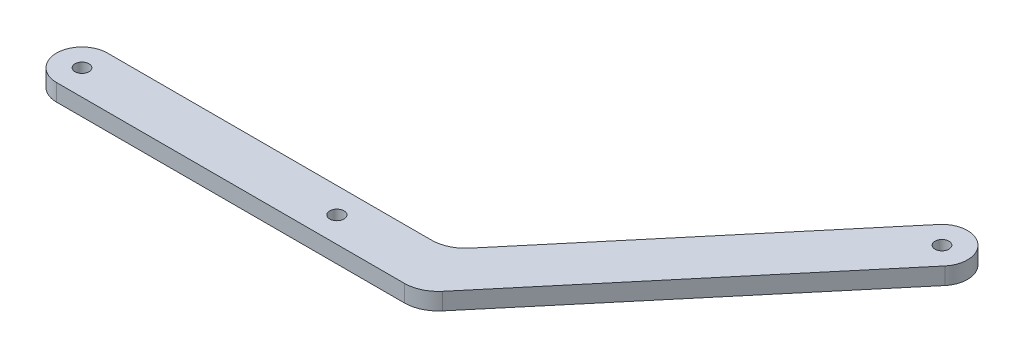
ISO-10303-21;
HEADER;
FILE_DESCRIPTION(('STEP AP214'),'2;1');
FILE_NAME('part.step','',(''),(''),'','','');
FILE_SCHEMA(('AUTOMOTIVE_DESIGN { 1 0 10303 214 1 1 1 1 }'));
ENDSEC;
DATA;
#1=APPLICATION_CONTEXT('core data for automotive mechanical design processes');
#2=APPLICATION_PROTOCOL_DEFINITION('international standard','automotive_design',2000,#1);
#3=PRODUCT_CONTEXT('',#1,'mechanical');
#4=PRODUCT('Part','Part','',(#3));
#5=PRODUCT_RELATED_PRODUCT_CATEGORY('part','',(#4));
#6=PRODUCT_DEFINITION_FORMATION('','',#4);
#7=PRODUCT_DEFINITION_CONTEXT('part definition',#1,'design');
#8=PRODUCT_DEFINITION('design','',#6,#7);
#9=PRODUCT_DEFINITION_SHAPE('','',#8);
#10=(LENGTH_UNIT() NAMED_UNIT(*) SI_UNIT(.MILLI.,.METRE.));
#11=(NAMED_UNIT(*) PLANE_ANGLE_UNIT() SI_UNIT($,.RADIAN.));
#12=(NAMED_UNIT(*) SI_UNIT($,.STERADIAN.) SOLID_ANGLE_UNIT());
#13=UNCERTAINTY_MEASURE_WITH_UNIT(LENGTH_MEASURE(1.E-05),#10,'distance_accuracy_value','');
#14=(GEOMETRIC_REPRESENTATION_CONTEXT(3) GLOBAL_UNCERTAINTY_ASSIGNED_CONTEXT((#13)) GLOBAL_UNIT_ASSIGNED_CONTEXT((#10,
#11,#12)) REPRESENTATION_CONTEXT('',''));
#15=CARTESIAN_POINT('',(0.,0.,0.));
#16=DIRECTION('',(0.,0.,1.));
#17=DIRECTION('',(1.,0.,0.));
#18=AXIS2_PLACEMENT_3D('',#15,#16,#17);
#19=CARTESIAN_POINT('',(-62.6973314606742,6.35,-0.214044943820216));
#20=DIRECTION('',(0.,1.,0.));
#21=DIRECTION('',(0.,0.,1.));
#22=AXIS2_PLACEMENT_3D('',#19,#20,#21);
#23=PLANE('',#22);
#24=CARTESIAN_POINT('',(155.391317213193,6.35,-103.475999794609));
#25=DIRECTION('',(0.,1.,0.));
#26=DIRECTION('',(0.,0.,1.));
#27=AXIS2_PLACEMENT_3D('',#24,#25,#26);
#28=CIRCLE('',#27,2.60349999999999);
#29=CARTESIAN_POINT('',(155.391317213193,6.35,-100.872499794609));
#30=VERTEX_POINT('',#29);
#31=EDGE_CURVE('E213',#30,#30,#28,.T.);
#32=ORIENTED_EDGE('',*,*,#31,.F.);
#33=EDGE_LOOP('',(#32));
#34=FACE_BOUND('',#33,.T.);
#35=CARTESIAN_POINT('',(-62.6973314606742,6.35,-0.214044943820216));
#36=DIRECTION('',(0.,1.,0.));
#37=DIRECTION('',(0.,0.,1.));
#38=AXIS2_PLACEMENT_3D('',#35,#36,#37);
#39=CIRCLE('',#38,9.525);
#40=CARTESIAN_POINT('',(-62.6973314606742,6.35,-9.73904494382022));
#41=VERTEX_POINT('',#40);
#42=CARTESIAN_POINT('',(-62.6973314606742,6.35,9.31095505617978));
#43=VERTEX_POINT('',#42);
#44=EDGE_CURVE('E164',#41,#43,#39,.T.);
#45=ORIENTED_EDGE('',*,*,#44,.T.);
#46=DIRECTION('',(1.,0.,0.));
#47=VECTOR('',#46,1.);
#48=CARTESIAN_POINT('',(-62.6973314606742,6.35,9.31095505617978));
#49=LINE('',#48,#47);
#50=CARTESIAN_POINT('',(67.2637221686101,6.35,9.31095505617978));
#51=VERTEX_POINT('',#50);
#52=EDGE_CURVE('E100',#43,#51,#49,.T.);
#53=ORIENTED_EDGE('',*,*,#52,.T.);
#54=CARTESIAN_POINT('',(67.2637221686101,6.35,-3.38904494382022));
#55=DIRECTION('',(0.,1.,0.));
#56=DIRECTION('',(0.,0.,1.));
#57=AXIS2_PLACEMENT_3D('',#54,#55,#56);
#58=CIRCLE('',#57,12.7);
#59=CARTESIAN_POINT('',(76.9924865962211,6.35,4.7743576991988));
#60=VERTEX_POINT('',#59);
#61=EDGE_CURVE('E185',#51,#60,#58,.T.);
#62=ORIENTED_EDGE('',*,*,#61,.T.);
#63=DIRECTION('',(0.642787609686537,0.,-0.76604444311898));
#64=VECTOR('',#63,1.);
#65=CARTESIAN_POINT('',(162.687890533902,6.35,-97.3534478123445));
#66=LINE('',#65,#64);
#67=CARTESIAN_POINT('',(162.687890533902,6.35,-97.3534478123445));
#68=VERTEX_POINT('',#67);
#69=EDGE_CURVE('E199',#60,#68,#66,.T.);
#70=ORIENTED_EDGE('',*,*,#69,.T.);
#71=CARTESIAN_POINT('',(155.391317213193,6.35,-103.475999794609));
#72=DIRECTION('',(0.,1.,0.));
#73=DIRECTION('',(0.,0.,-1.));
#74=AXIS2_PLACEMENT_3D('',#71,#72,#73);
#75=CIRCLE('',#74,9.525);
#76=CARTESIAN_POINT('',(148.094743892485,6.35,-109.598551776873));
#77=VERTEX_POINT('',#76);
#78=EDGE_CURVE('E119',#68,#77,#75,.T.);
#79=ORIENTED_EDGE('',*,*,#78,.T.);
#80=DIRECTION('',(-0.642787609686537,0.,0.76604444311898));
#81=VECTOR('',#80,1.);
#82=CARTESIAN_POINT('',(68.1093257083684,6.35,-14.2756423008012));
#83=LINE('',#82,#81);
#84=CARTESIAN_POINT('',(68.1093257083684,6.35,-14.2756423008012));
#85=VERTEX_POINT('',#84);
#86=EDGE_CURVE('E113',#77,#85,#83,.T.);
#87=ORIENTED_EDGE('',*,*,#86,.T.);
#88=CARTESIAN_POINT('',(58.3805612807573,6.35,-22.4390449438202));
#89=DIRECTION('',(0.,-1.,0.));
#90=DIRECTION('',(0.,0.,1.));
#91=AXIS2_PLACEMENT_3D('',#88,#89,#90);
#92=CIRCLE('',#91,12.7);
#93=CARTESIAN_POINT('',(58.3805612807573,6.35,-9.73904494382021));
#94=VERTEX_POINT('',#93);
#95=EDGE_CURVE('E117',#85,#94,#92,.T.);
#96=ORIENTED_EDGE('',*,*,#95,.T.);
#97=DIRECTION('',(-1.,0.,0.));
#98=VECTOR('',#97,1.);
#99=CARTESIAN_POINT('',(-62.6973314606742,6.35,-9.73904494382022));
#100=LINE('',#99,#98);
#101=EDGE_CURVE('E57',#94,#41,#100,.T.);
#102=ORIENTED_EDGE('',*,*,#101,.T.);
#103=EDGE_LOOP('',(#45,#53,#62,#70,#79,#87,#96,#102));
#104=FACE_BOUND('',#103,.T.);
#105=CARTESIAN_POINT('',(-62.6973314606742,6.35,-0.214044943820216));
#106=DIRECTION('',(0.,1.,0.));
#107=DIRECTION('',(0.,0.,1.));
#108=AXIS2_PLACEMENT_3D('',#105,#106,#107);
#109=CIRCLE('',#108,2.6035);
#110=CARTESIAN_POINT('',(-62.6973314606742,6.35,2.38945505617979));
#111=VERTEX_POINT('',#110);
#112=EDGE_CURVE('E146',#111,#111,#109,.T.);
#113=ORIENTED_EDGE('',*,*,#112,.F.);
#114=EDGE_LOOP('',(#113));
#115=FACE_BOUND('',#114,.T.);
#116=CARTESIAN_POINT('',(32.5526685393258,6.35,-0.214044943820216));
#117=DIRECTION('',(0.,1.,0.));
#118=DIRECTION('',(0.,0.,1.));
#119=AXIS2_PLACEMENT_3D('',#116,#117,#118);
#120=CIRCLE('',#119,2.667);
#121=CARTESIAN_POINT('',(32.5526685393258,6.35,2.45295505617979));
#122=VERTEX_POINT('',#121);
#123=EDGE_CURVE('E221',#122,#122,#120,.T.);
#124=ORIENTED_EDGE('',*,*,#123,.F.);
#125=EDGE_LOOP('',(#124));
#126=FACE_BOUND('',#125,.T.);
#127=ADVANCED_FACE('F39',(#34,#104,#115,#126),#23,.T.);
#128=CARTESIAN_POINT('',(-62.6973314606742,0.,-0.214044943820216));
#129=DIRECTION('',(0.,1.,0.));
#130=DIRECTION('',(0.,0.,1.));
#131=AXIS2_PLACEMENT_3D('',#128,#129,#130);
#132=PLANE('',#131);
#133=CARTESIAN_POINT('',(-62.6973314606742,0.,-0.214044943820216));
#134=DIRECTION('',(0.,1.,0.));
#135=DIRECTION('',(0.,0.,1.));
#136=AXIS2_PLACEMENT_3D('',#133,#134,#135);
#137=CIRCLE('',#136,9.525);
#138=CARTESIAN_POINT('',(-62.6973314606742,0.,-9.73904494382022));
#139=VERTEX_POINT('',#138);
#140=CARTESIAN_POINT('',(-62.6973314606742,0.,9.31095505617978));
#141=VERTEX_POINT('',#140);
#142=EDGE_CURVE('E141',#139,#141,#137,.T.);
#143=ORIENTED_EDGE('',*,*,#142,.F.);
#144=DIRECTION('',(-1.,0.,0.));
#145=VECTOR('',#144,1.);
#146=CARTESIAN_POINT('',(-62.6973314606742,0.,-9.73904494382022));
#147=LINE('',#146,#145);
#148=CARTESIAN_POINT('',(58.3805612807573,0.,-9.73904494382021));
#149=VERTEX_POINT('',#148);
#150=EDGE_CURVE('E92',#149,#139,#147,.T.);
#151=ORIENTED_EDGE('',*,*,#150,.F.);
#152=CARTESIAN_POINT('',(58.3805612807573,0.,-22.4390449438202));
#153=DIRECTION('',(0.,-1.,0.));
#154=DIRECTION('',(0.,0.,1.));
#155=AXIS2_PLACEMENT_3D('',#152,#153,#154);
#156=CIRCLE('',#155,12.7);
#157=CARTESIAN_POINT('',(68.1093257083684,0.,-14.2756423008012));
#158=VERTEX_POINT('',#157);
#159=EDGE_CURVE('E86',#158,#149,#156,.T.);
#160=ORIENTED_EDGE('',*,*,#159,.F.);
#161=DIRECTION('',(-0.642787609686537,0.,0.76604444311898));
#162=VECTOR('',#161,1.);
#163=CARTESIAN_POINT('',(68.1093257083684,0.,-14.2756423008012));
#164=LINE('',#163,#162);
#165=CARTESIAN_POINT('',(148.094743892485,0.,-109.598551776873));
#166=VERTEX_POINT('',#165);
#167=EDGE_CURVE('E128',#166,#158,#164,.T.);
#168=ORIENTED_EDGE('',*,*,#167,.F.);
#169=CARTESIAN_POINT('',(155.391317213193,0.,-103.475999794609));
#170=DIRECTION('',(0.,1.,0.));
#171=DIRECTION('',(0.,0.,-1.));
#172=AXIS2_PLACEMENT_3D('',#169,#170,#171);
#173=CIRCLE('',#172,9.525);
#174=CARTESIAN_POINT('',(162.687890533902,0.,-97.3534478123445));
#175=VERTEX_POINT('',#174);
#176=EDGE_CURVE('E155',#175,#166,#173,.T.);
#177=ORIENTED_EDGE('',*,*,#176,.F.);
#178=DIRECTION('',(0.642787609686537,0.,-0.76604444311898));
#179=VECTOR('',#178,1.);
#180=CARTESIAN_POINT('',(162.687890533902,0.,-97.3534478123445));
#181=LINE('',#180,#179);
#182=CARTESIAN_POINT('',(76.9924865962211,0.,4.7743576991988));
#183=VERTEX_POINT('',#182);
#184=EDGE_CURVE('E152',#183,#175,#181,.T.);
#185=ORIENTED_EDGE('',*,*,#184,.F.);
#186=CARTESIAN_POINT('',(67.2637221686101,0.,-3.38904494382022));
#187=DIRECTION('',(0.,1.,0.));
#188=DIRECTION('',(0.,0.,1.));
#189=AXIS2_PLACEMENT_3D('',#186,#187,#188);
#190=CIRCLE('',#189,12.7);
#191=CARTESIAN_POINT('',(67.2637221686101,0.,9.31095505617978));
#192=VERTEX_POINT('',#191);
#193=EDGE_CURVE('E149',#192,#183,#190,.T.);
#194=ORIENTED_EDGE('',*,*,#193,.F.);
#195=DIRECTION('',(1.,0.,0.));
#196=VECTOR('',#195,1.);
#197=CARTESIAN_POINT('',(64.3026685393258,0.,9.31095505617978));
#198=LINE('',#197,#196);
#199=EDGE_CURVE('E145',#141,#192,#198,.T.);
#200=ORIENTED_EDGE('',*,*,#199,.F.);
#201=EDGE_LOOP('',(#143,#151,#160,#168,#177,#185,#194,#200));
#202=FACE_BOUND('',#201,.T.);
#203=CARTESIAN_POINT('',(-62.6973314606742,0.,-0.214044943820216));
#204=DIRECTION('',(0.,1.,0.));
#205=DIRECTION('',(0.,0.,1.));
#206=AXIS2_PLACEMENT_3D('',#203,#204,#205);
#207=CIRCLE('',#206,2.6035);
#208=CARTESIAN_POINT('',(-62.6973314606742,0.,2.38945505617979));
#209=VERTEX_POINT('',#208);
#210=EDGE_CURVE('E209',#209,#209,#207,.T.);
#211=ORIENTED_EDGE('',*,*,#210,.T.);
#212=EDGE_LOOP('',(#211));
#213=FACE_BOUND('',#212,.T.);
#214=CARTESIAN_POINT('',(155.391317213193,0.,-103.475999794609));
#215=DIRECTION('',(0.,1.,0.));
#216=DIRECTION('',(0.,0.,1.));
#217=AXIS2_PLACEMENT_3D('',#214,#215,#216);
#218=CIRCLE('',#217,2.60349999999999);
#219=CARTESIAN_POINT('',(155.391317213193,0.,-100.872499794609));
#220=VERTEX_POINT('',#219);
#221=EDGE_CURVE('E217',#220,#220,#218,.T.);
#222=ORIENTED_EDGE('',*,*,#221,.T.);
#223=EDGE_LOOP('',(#222));
#224=FACE_BOUND('',#223,.T.);
#225=CARTESIAN_POINT('',(32.5526685393258,0.,-0.214044943820216));
#226=DIRECTION('',(0.,1.,0.));
#227=DIRECTION('',(0.,0.,1.));
#228=AXIS2_PLACEMENT_3D('',#225,#226,#227);
#229=CIRCLE('',#228,2.667);
#230=CARTESIAN_POINT('',(32.5526685393258,0.,2.45295505617979));
#231=VERTEX_POINT('',#230);
#232=EDGE_CURVE('E225',#231,#231,#229,.T.);
#233=ORIENTED_EDGE('',*,*,#232,.T.);
#234=EDGE_LOOP('',(#233));
#235=FACE_BOUND('',#234,.T.);
#236=ADVANCED_FACE('F189',(#202,#213,#224,#235),#132,.F.);
#237=CARTESIAN_POINT('',(-62.6973314606742,6.35,-0.214044943820216));
#238=DIRECTION('',(0.,-1.,0.));
#239=DIRECTION('',(0.,0.,-1.));
#240=AXIS2_PLACEMENT_3D('',#237,#238,#239);
#241=CYLINDRICAL_SURFACE('',#240,9.525);
#242=ORIENTED_EDGE('',*,*,#142,.T.);
#243=DIRECTION('',(0.,-1.,0.));
#244=VECTOR('',#243,1.);
#245=CARTESIAN_POINT('',(-62.6973314606742,6.35,9.31095505617978));
#246=LINE('',#245,#244);
#247=EDGE_CURVE('E11',#43,#141,#246,.T.);
#248=ORIENTED_EDGE('',*,*,#247,.F.);
#249=ORIENTED_EDGE('',*,*,#44,.F.);
#250=DIRECTION('',(0.,-1.,0.));
#251=VECTOR('',#250,1.);
#252=CARTESIAN_POINT('',(-62.6973314606742,6.35,-9.73904494382022));
#253=LINE('',#252,#251);
#254=EDGE_CURVE('E137',#41,#139,#253,.T.);
#255=ORIENTED_EDGE('',*,*,#254,.T.);
#256=EDGE_LOOP('',(#242,#248,#249,#255));
#257=FACE_BOUND('',#256,.T.);
#258=ADVANCED_FACE('F41',(#257),#241,.T.);
#259=CARTESIAN_POINT('',(64.3026685393258,6.35,9.31095505617978));
#260=DIRECTION('',(0.,0.,-1.));
#261=DIRECTION('',(-1.,0.,0.));
#262=AXIS2_PLACEMENT_3D('',#259,#260,#261);
#263=PLANE('',#262);
#264=ORIENTED_EDGE('',*,*,#199,.T.);
#265=DIRECTION('',(0.,-1.,0.));
#266=VECTOR('',#265,1.);
#267=CARTESIAN_POINT('',(67.2637221686101,6.35,9.31095505617978));
#268=LINE('',#267,#266);
#269=EDGE_CURVE('E49',#51,#192,#268,.T.);
#270=ORIENTED_EDGE('',*,*,#269,.F.);
#271=ORIENTED_EDGE('',*,*,#52,.F.);
#272=ORIENTED_EDGE('',*,*,#247,.T.);
#273=EDGE_LOOP('',(#264,#270,#271,#272));
#274=FACE_BOUND('',#273,.T.);
#275=ADVANCED_FACE('F260',(#274),#263,.F.);
#276=CARTESIAN_POINT('',(67.2637221686101,6.35,-3.38904494382022));
#277=DIRECTION('',(0.,-1.,0.));
#278=DIRECTION('',(0.,0.,-1.));
#279=AXIS2_PLACEMENT_3D('',#276,#277,#278);
#280=CYLINDRICAL_SURFACE('',#279,12.7);
#281=ORIENTED_EDGE('',*,*,#193,.T.);
#282=DIRECTION('',(0.,-1.,0.));
#283=VECTOR('',#282,1.);
#284=CARTESIAN_POINT('',(76.9924865962211,6.35,4.7743576991988));
#285=LINE('',#284,#283);
#286=EDGE_CURVE('E175',#60,#183,#285,.T.);
#287=ORIENTED_EDGE('',*,*,#286,.F.);
#288=ORIENTED_EDGE('',*,*,#61,.F.);
#289=ORIENTED_EDGE('',*,*,#269,.T.);
#290=EDGE_LOOP('',(#281,#287,#288,#289));
#291=FACE_BOUND('',#290,.T.);
#292=ADVANCED_FACE('F183',(#291),#280,.T.);
#293=CARTESIAN_POINT('',(162.687890533902,6.35,-97.3534478123445));
#294=DIRECTION('',(-0.76604444311898,0.,-0.642787609686537));
#295=DIRECTION('',(-0.642787609686537,0.,0.76604444311898));
#296=AXIS2_PLACEMENT_3D('',#293,#294,#295);
#297=PLANE('',#296);
#298=ORIENTED_EDGE('',*,*,#184,.T.);
#299=DIRECTION('',(0.,-1.,0.));
#300=VECTOR('',#299,1.);
#301=CARTESIAN_POINT('',(162.687890533902,6.35,-97.3534478123445));
#302=LINE('',#301,#300);
#303=EDGE_CURVE('E171',#68,#175,#302,.T.);
#304=ORIENTED_EDGE('',*,*,#303,.F.);
#305=ORIENTED_EDGE('',*,*,#69,.F.);
#306=ORIENTED_EDGE('',*,*,#286,.T.);
#307=EDGE_LOOP('',(#298,#304,#305,#306));
#308=FACE_BOUND('',#307,.T.);
#309=ADVANCED_FACE('F194',(#308),#297,.F.);
#310=CARTESIAN_POINT('',(155.391317213193,6.35,-103.475999794609));
#311=DIRECTION('',(0.,-1.,0.));
#312=DIRECTION('',(0.,0.,-1.));
#313=AXIS2_PLACEMENT_3D('',#310,#311,#312);
#314=CYLINDRICAL_SURFACE('',#313,9.525);
#315=ORIENTED_EDGE('',*,*,#176,.T.);
#316=DIRECTION('',(0.,-1.,0.));
#317=VECTOR('',#316,1.);
#318=CARTESIAN_POINT('',(148.094743892485,6.35,-109.598551776873));
#319=LINE('',#318,#317);
#320=EDGE_CURVE('E130',#77,#166,#319,.T.);
#321=ORIENTED_EDGE('',*,*,#320,.F.);
#322=ORIENTED_EDGE('',*,*,#78,.F.);
#323=ORIENTED_EDGE('',*,*,#303,.T.);
#324=EDGE_LOOP('',(#315,#321,#322,#323));
#325=FACE_BOUND('',#324,.T.);
#326=ADVANCED_FACE('F197',(#325),#314,.T.);
#327=CARTESIAN_POINT('',(68.1093257083684,6.35,-14.2756423008012));
#328=DIRECTION('',(0.76604444311898,0.,0.642787609686537));
#329=DIRECTION('',(0.642787609686537,0.,-0.76604444311898));
#330=AXIS2_PLACEMENT_3D('',#327,#328,#329);
#331=PLANE('',#330);
#332=ORIENTED_EDGE('',*,*,#167,.T.);
#333=DIRECTION('',(0.,-1.,0.));
#334=VECTOR('',#333,1.);
#335=CARTESIAN_POINT('',(68.1093257083684,6.35,-14.2756423008012));
#336=LINE('',#335,#334);
#337=EDGE_CURVE('E125',#85,#158,#336,.T.);
#338=ORIENTED_EDGE('',*,*,#337,.F.);
#339=ORIENTED_EDGE('',*,*,#86,.F.);
#340=ORIENTED_EDGE('',*,*,#320,.T.);
#341=EDGE_LOOP('',(#332,#338,#339,#340));
#342=FACE_BOUND('',#341,.T.);
#343=ADVANCED_FACE('F126',(#342),#331,.F.);
#344=CARTESIAN_POINT('',(58.3805612807573,6.35,-22.4390449438202));
#345=DIRECTION('',(0.,-1.,0.));
#346=DIRECTION('',(0.,0.,-1.));
#347=AXIS2_PLACEMENT_3D('',#344,#345,#346);
#348=CYLINDRICAL_SURFACE('',#347,12.7);
#349=ORIENTED_EDGE('',*,*,#159,.T.);
#350=DIRECTION('',(0.,-1.,0.));
#351=VECTOR('',#350,1.);
#352=CARTESIAN_POINT('',(58.3805612807573,6.35,-9.73904494382021));
#353=LINE('',#352,#351);
#354=EDGE_CURVE('E131',#94,#149,#353,.T.);
#355=ORIENTED_EDGE('',*,*,#354,.F.);
#356=ORIENTED_EDGE('',*,*,#95,.F.);
#357=ORIENTED_EDGE('',*,*,#337,.T.);
#358=EDGE_LOOP('',(#349,#355,#356,#357));
#359=FACE_BOUND('',#358,.T.);
#360=ADVANCED_FACE('F133',(#359),#348,.F.);
#361=CARTESIAN_POINT('',(-62.6973314606742,6.35,-9.73904494382022));
#362=DIRECTION('',(0.,0.,1.));
#363=DIRECTION('',(1.,0.,0.));
#364=AXIS2_PLACEMENT_3D('',#361,#362,#363);
#365=PLANE('',#364);
#366=ORIENTED_EDGE('',*,*,#150,.T.);
#367=ORIENTED_EDGE('',*,*,#254,.F.);
#368=ORIENTED_EDGE('',*,*,#101,.F.);
#369=ORIENTED_EDGE('',*,*,#354,.T.);
#370=EDGE_LOOP('',(#366,#367,#368,#369));
#371=FACE_BOUND('',#370,.T.);
#372=ADVANCED_FACE('F248',(#371),#365,.F.);
#373=CARTESIAN_POINT('',(-62.6973314606742,6.35,-0.214044943820216));
#374=DIRECTION('',(0.,-1.,0.));
#375=DIRECTION('',(0.,0.,-1.));
#376=AXIS2_PLACEMENT_3D('',#373,#374,#375);
#377=CYLINDRICAL_SURFACE('',#376,2.6035);
#378=ORIENTED_EDGE('',*,*,#112,.T.);
#379=EDGE_LOOP('',(#378));
#380=FACE_BOUND('',#379,.T.);
#381=ORIENTED_EDGE('',*,*,#210,.F.);
#382=EDGE_LOOP('',(#381));
#383=FACE_BOUND('',#382,.T.);
#384=ADVANCED_FACE('F245',(#380,#383),#377,.F.);
#385=CARTESIAN_POINT('',(155.391317213193,6.35,-103.475999794609));
#386=DIRECTION('',(0.,-1.,0.));
#387=DIRECTION('',(0.,0.,-1.));
#388=AXIS2_PLACEMENT_3D('',#385,#386,#387);
#389=CYLINDRICAL_SURFACE('',#388,2.60349999999999);
#390=ORIENTED_EDGE('',*,*,#31,.T.);
#391=EDGE_LOOP('',(#390));
#392=FACE_BOUND('',#391,.T.);
#393=ORIENTED_EDGE('',*,*,#221,.F.);
#394=EDGE_LOOP('',(#393));
#395=FACE_BOUND('',#394,.T.);
#396=ADVANCED_FACE('F327',(#392,#395),#389,.F.);
#397=CARTESIAN_POINT('',(32.5526685393258,6.35,-0.214044943820216));
#398=DIRECTION('',(0.,-1.,0.));
#399=DIRECTION('',(0.,0.,-1.));
#400=AXIS2_PLACEMENT_3D('',#397,#398,#399);
#401=CYLINDRICAL_SURFACE('',#400,2.667);
#402=ORIENTED_EDGE('',*,*,#123,.T.);
#403=EDGE_LOOP('',(#402));
#404=FACE_BOUND('',#403,.T.);
#405=ORIENTED_EDGE('',*,*,#232,.F.);
#406=EDGE_LOOP('',(#405));
#407=FACE_BOUND('',#406,.T.);
#408=ADVANCED_FACE('F233',(#404,#407),#401,.F.);
#409=CLOSED_SHELL('',(#127,#236,#258,#275,#292,#309,#326,#343,#360,#372,#384,#396,#408));
#410=MANIFOLD_SOLID_BREP('B2',#409);
#411=ADVANCED_BREP_SHAPE_REPRESENTATION('',(#18,#410),#14);
#412=SHAPE_DEFINITION_REPRESENTATION(#9,#411);
ENDSEC;
END-ISO-10303-21;
